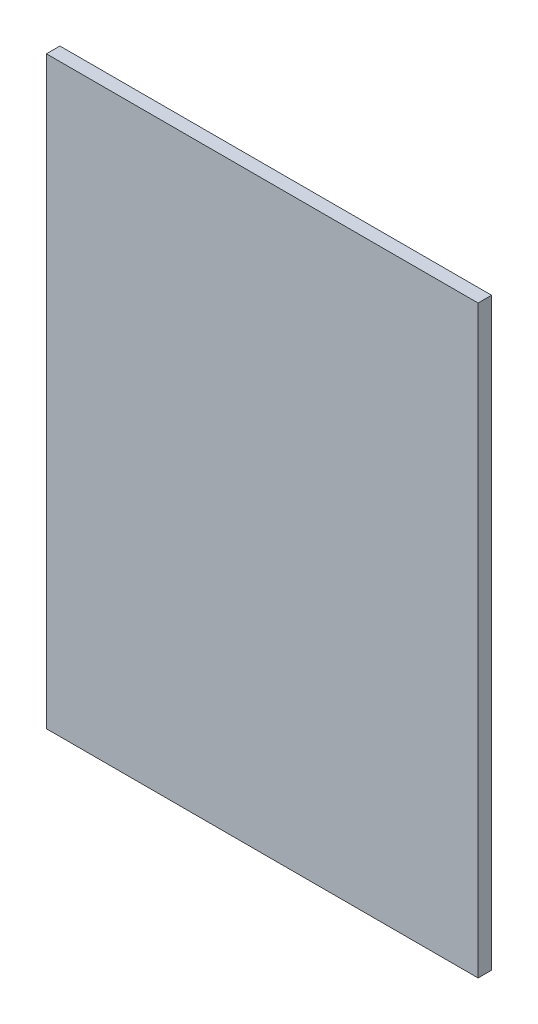
ISO-10303-21;
HEADER;
FILE_DESCRIPTION(('STEP AP214'),'2;1');
FILE_NAME('part.step','',(''),(''),'','','');
FILE_SCHEMA(('AUTOMOTIVE_DESIGN { 1 0 10303 214 1 1 1 1 }'));
ENDSEC;
DATA;
#1=APPLICATION_CONTEXT('core data for automotive mechanical design processes');
#2=APPLICATION_PROTOCOL_DEFINITION('international standard','automotive_design',2000,#1);
#3=PRODUCT_CONTEXT('',#1,'mechanical');
#4=PRODUCT('Part','Part','',(#3));
#5=PRODUCT_RELATED_PRODUCT_CATEGORY('part','',(#4));
#6=PRODUCT_DEFINITION_FORMATION('','',#4);
#7=PRODUCT_DEFINITION_CONTEXT('part definition',#1,'design');
#8=PRODUCT_DEFINITION('design','',#6,#7);
#9=PRODUCT_DEFINITION_SHAPE('','',#8);
#10=(LENGTH_UNIT() NAMED_UNIT(*) SI_UNIT(.MILLI.,.METRE.));
#11=(NAMED_UNIT(*) PLANE_ANGLE_UNIT() SI_UNIT($,.RADIAN.));
#12=(NAMED_UNIT(*) SI_UNIT($,.STERADIAN.) SOLID_ANGLE_UNIT());
#13=UNCERTAINTY_MEASURE_WITH_UNIT(LENGTH_MEASURE(1.E-05),#10,'distance_accuracy_value','');
#14=(GEOMETRIC_REPRESENTATION_CONTEXT(3) GLOBAL_UNCERTAINTY_ASSIGNED_CONTEXT((#13)) GLOBAL_UNIT_ASSIGNED_CONTEXT((#10,
#11,#12)) REPRESENTATION_CONTEXT('',''));
#15=CARTESIAN_POINT('',(0.,0.,0.));
#16=DIRECTION('',(0.,0.,1.));
#17=DIRECTION('',(1.,0.,0.));
#18=AXIS2_PLACEMENT_3D('',#15,#16,#17);
#19=CARTESIAN_POINT('',(-29.4865900383142,51.6858237547893,3.));
#20=DIRECTION('',(1.,0.,0.));
#21=DIRECTION('',(0.,1.,0.));
#22=AXIS2_PLACEMENT_3D('',#19,#20,#21);
#23=PLANE('',#22);
#24=DIRECTION('',(0.,-1.,0.));
#25=VECTOR('',#24,1.);
#26=CARTESIAN_POINT('',(-29.4865900383142,51.6858237547893,0.));
#27=LINE('',#26,#25);
#28=CARTESIAN_POINT('',(-29.4865900383142,51.6858237547893,0.));
#29=VERTEX_POINT('',#28);
#30=CARTESIAN_POINT('',(-29.4865900383142,-78.3141762452107,0.));
#31=VERTEX_POINT('',#30);
#32=EDGE_CURVE('E100',#29,#31,#27,.T.);
#33=ORIENTED_EDGE('',*,*,#32,.T.);
#34=DIRECTION('',(0.,0.,-1.));
#35=VECTOR('',#34,1.);
#36=CARTESIAN_POINT('',(-29.4865900383142,-78.3141762452107,3.));
#37=LINE('',#36,#35);
#38=CARTESIAN_POINT('',(-29.4865900383142,-78.3141762452107,3.));
#39=VERTEX_POINT('',#38);
#40=EDGE_CURVE('E11',#39,#31,#37,.T.);
#41=ORIENTED_EDGE('',*,*,#40,.F.);
#42=DIRECTION('',(0.,-1.,0.));
#43=VECTOR('',#42,1.);
#44=CARTESIAN_POINT('',(-29.4865900383142,51.6858237547893,3.));
#45=LINE('',#44,#43);
#46=CARTESIAN_POINT('',(-29.4865900383142,51.6858237547893,3.));
#47=VERTEX_POINT('',#46);
#48=EDGE_CURVE('E88',#47,#39,#45,.T.);
#49=ORIENTED_EDGE('',*,*,#48,.F.);
#50=DIRECTION('',(0.,0.,-1.));
#51=VECTOR('',#50,1.);
#52=CARTESIAN_POINT('',(-29.4865900383142,51.6858237547893,3.));
#53=LINE('',#52,#51);
#54=EDGE_CURVE('E96',#47,#29,#53,.T.);
#55=ORIENTED_EDGE('',*,*,#54,.T.);
#56=EDGE_LOOP('',(#33,#41,#49,#55));
#57=FACE_BOUND('',#56,.T.);
#58=ADVANCED_FACE('F37',(#57),#23,.F.);
#59=CARTESIAN_POINT('',(-29.4865900383142,-78.3141762452107,3.));
#60=DIRECTION('',(0.,1.,0.));
#61=DIRECTION('',(0.,0.,1.));
#62=AXIS2_PLACEMENT_3D('',#59,#60,#61);
#63=PLANE('',#62);
#64=DIRECTION('',(1.,0.,0.));
#65=VECTOR('',#64,1.);
#66=CARTESIAN_POINT('',(-29.4865900383142,-78.3141762452107,0.));
#67=LINE('',#66,#65);
#68=CARTESIAN_POINT('',(66.5134099616858,-78.3141762452107,0.));
#69=VERTEX_POINT('',#68);
#70=EDGE_CURVE('E92',#31,#69,#67,.T.);
#71=ORIENTED_EDGE('',*,*,#70,.T.);
#72=DIRECTION('',(0.,0.,-1.));
#73=VECTOR('',#72,1.);
#74=CARTESIAN_POINT('',(66.5134099616858,-78.3141762452107,3.));
#75=LINE('',#74,#73);
#76=CARTESIAN_POINT('',(66.5134099616858,-78.3141762452107,3.));
#77=VERTEX_POINT('',#76);
#78=EDGE_CURVE('E45',#77,#69,#75,.T.);
#79=ORIENTED_EDGE('',*,*,#78,.F.);
#80=DIRECTION('',(1.,0.,0.));
#81=VECTOR('',#80,1.);
#82=CARTESIAN_POINT('',(-29.4865900383142,-78.3141762452107,3.));
#83=LINE('',#82,#81);
#84=EDGE_CURVE('E83',#39,#77,#83,.T.);
#85=ORIENTED_EDGE('',*,*,#84,.F.);
#86=ORIENTED_EDGE('',*,*,#40,.T.);
#87=EDGE_LOOP('',(#71,#79,#85,#86));
#88=FACE_BOUND('',#87,.T.);
#89=ADVANCED_FACE('F91',(#88),#63,.F.);
#90=CARTESIAN_POINT('',(66.5134099616858,51.6858237547893,3.));
#91=DIRECTION('',(-1.,0.,0.));
#92=DIRECTION('',(0.,-1.,0.));
#93=AXIS2_PLACEMENT_3D('',#90,#91,#92);
#94=PLANE('',#93);
#95=DIRECTION('',(0.,1.,0.));
#96=VECTOR('',#95,1.);
#97=CARTESIAN_POINT('',(66.5134099616858,51.6858237547893,0.));
#98=LINE('',#97,#96);
#99=CARTESIAN_POINT('',(66.5134099616858,51.6858237547893,0.));
#100=VERTEX_POINT('',#99);
#101=EDGE_CURVE('E70',#69,#100,#98,.T.);
#102=ORIENTED_EDGE('',*,*,#101,.T.);
#103=DIRECTION('',(0.,0.,-1.));
#104=VECTOR('',#103,1.);
#105=CARTESIAN_POINT('',(66.5134099616858,51.6858237547893,3.));
#106=LINE('',#105,#104);
#107=CARTESIAN_POINT('',(66.5134099616858,51.6858237547893,3.));
#108=VERTEX_POINT('',#107);
#109=EDGE_CURVE('E93',#108,#100,#106,.T.);
#110=ORIENTED_EDGE('',*,*,#109,.F.);
#111=DIRECTION('',(0.,1.,0.));
#112=VECTOR('',#111,1.);
#113=CARTESIAN_POINT('',(66.5134099616858,51.6858237547893,3.));
#114=LINE('',#113,#112);
#115=EDGE_CURVE('E86',#77,#108,#114,.T.);
#116=ORIENTED_EDGE('',*,*,#115,.F.);
#117=ORIENTED_EDGE('',*,*,#78,.T.);
#118=EDGE_LOOP('',(#102,#110,#116,#117));
#119=FACE_BOUND('',#118,.T.);
#120=ADVANCED_FACE('F94',(#119),#94,.F.);
#121=CARTESIAN_POINT('',(-29.4865900383142,51.6858237547893,3.));
#122=DIRECTION('',(0.,-1.,0.));
#123=DIRECTION('',(0.,0.,-1.));
#124=AXIS2_PLACEMENT_3D('',#121,#122,#123);
#125=PLANE('',#124);
#126=DIRECTION('',(-1.,0.,0.));
#127=VECTOR('',#126,1.);
#128=CARTESIAN_POINT('',(-29.4865900383142,51.6858237547893,0.));
#129=LINE('',#128,#127);
#130=EDGE_CURVE('E76',#100,#29,#129,.T.);
#131=ORIENTED_EDGE('',*,*,#130,.T.);
#132=ORIENTED_EDGE('',*,*,#54,.F.);
#133=DIRECTION('',(-1.,0.,0.));
#134=VECTOR('',#133,1.);
#135=CARTESIAN_POINT('',(-29.4865900383142,51.6858237547893,3.));
#136=LINE('',#135,#134);
#137=EDGE_CURVE('E53',#108,#47,#136,.T.);
#138=ORIENTED_EDGE('',*,*,#137,.F.);
#139=ORIENTED_EDGE('',*,*,#109,.T.);
#140=EDGE_LOOP('',(#131,#132,#138,#139));
#141=FACE_BOUND('',#140,.T.);
#142=ADVANCED_FACE('F107',(#141),#125,.F.);
#143=CARTESIAN_POINT('',(0.,0.,3.));
#144=DIRECTION('',(0.,0.,1.));
#145=DIRECTION('',(1.,0.,0.));
#146=AXIS2_PLACEMENT_3D('',#143,#144,#145);
#147=PLANE('',#146);
#148=ORIENTED_EDGE('',*,*,#48,.T.);
#149=ORIENTED_EDGE('',*,*,#84,.T.);
#150=ORIENTED_EDGE('',*,*,#115,.T.);
#151=ORIENTED_EDGE('',*,*,#137,.T.);
#152=EDGE_LOOP('',(#148,#149,#150,#151));
#153=FACE_BOUND('',#152,.T.);
#154=ADVANCED_FACE('F84',(#153),#147,.T.);
#155=CARTESIAN_POINT('',(0.,0.,0.));
#156=DIRECTION('',(0.,0.,1.));
#157=DIRECTION('',(1.,0.,0.));
#158=AXIS2_PLACEMENT_3D('',#155,#156,#157);
#159=PLANE('',#158);
#160=ORIENTED_EDGE('',*,*,#32,.F.);
#161=ORIENTED_EDGE('',*,*,#130,.F.);
#162=ORIENTED_EDGE('',*,*,#101,.F.);
#163=ORIENTED_EDGE('',*,*,#70,.F.);
#164=EDGE_LOOP('',(#160,#161,#162,#163));
#165=FACE_BOUND('',#164,.T.);
#166=ADVANCED_FACE('F110',(#165),#159,.F.);
#167=CLOSED_SHELL('',(#58,#89,#120,#142,#154,#166));
#168=MANIFOLD_SOLID_BREP('B2',#167);
#169=ADVANCED_BREP_SHAPE_REPRESENTATION('',(#18,#168),#14);
#170=SHAPE_DEFINITION_REPRESENTATION(#9,#169);
ENDSEC;
END-ISO-10303-21;
